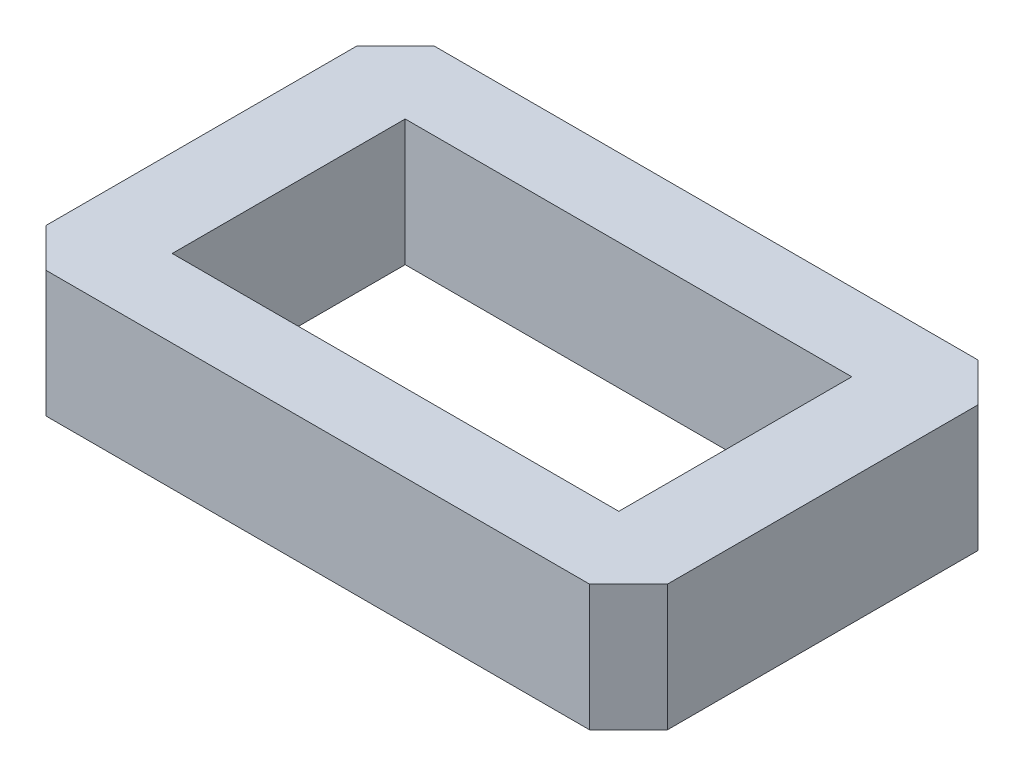
ISO-10303-21;
HEADER;
FILE_DESCRIPTION(('STEP AP214'),'2;1');
FILE_NAME('part.step','',(''),(''),'','','');
FILE_SCHEMA(('AUTOMOTIVE_DESIGN { 1 0 10303 214 1 1 1 1 }'));
ENDSEC;
DATA;
#1=APPLICATION_CONTEXT('core data for automotive mechanical design processes');
#2=APPLICATION_PROTOCOL_DEFINITION('international standard','automotive_design',2000,#1);
#3=PRODUCT_CONTEXT('',#1,'mechanical');
#4=PRODUCT('Part','Part','',(#3));
#5=PRODUCT_RELATED_PRODUCT_CATEGORY('part','',(#4));
#6=PRODUCT_DEFINITION_FORMATION('','',#4);
#7=PRODUCT_DEFINITION_CONTEXT('part definition',#1,'design');
#8=PRODUCT_DEFINITION('design','',#6,#7);
#9=PRODUCT_DEFINITION_SHAPE('','',#8);
#10=(LENGTH_UNIT() NAMED_UNIT(*) SI_UNIT(.MILLI.,.METRE.));
#11=(NAMED_UNIT(*) PLANE_ANGLE_UNIT() SI_UNIT($,.RADIAN.));
#12=(NAMED_UNIT(*) SI_UNIT($,.STERADIAN.) SOLID_ANGLE_UNIT());
#13=UNCERTAINTY_MEASURE_WITH_UNIT(LENGTH_MEASURE(1.E-05),#10,'distance_accuracy_value','');
#14=(GEOMETRIC_REPRESENTATION_CONTEXT(3) GLOBAL_UNCERTAINTY_ASSIGNED_CONTEXT((#13)) GLOBAL_UNIT_ASSIGNED_CONTEXT((#10,
#11,#12)) REPRESENTATION_CONTEXT('',''));
#15=CARTESIAN_POINT('',(0.,0.,0.));
#16=DIRECTION('',(0.,0.,1.));
#17=DIRECTION('',(1.,0.,0.));
#18=AXIS2_PLACEMENT_3D('',#15,#16,#17);
#19=CARTESIAN_POINT('',(0.,6.5,0.));
#20=DIRECTION('',(0.,-1.,0.));
#21=DIRECTION('',(0.,0.,-1.));
#22=AXIS2_PLACEMENT_3D('',#19,#20,#21);
#23=PLANE('',#22);
#24=DIRECTION('',(0.,0.,-1.));
#25=VECTOR('',#24,1.);
#26=CARTESIAN_POINT('',(32.,6.5,0.));
#27=LINE('',#26,#25);
#28=CARTESIAN_POINT('',(32.,6.5,-2.));
#29=VERTEX_POINT('',#28);
#30=CARTESIAN_POINT('',(32.,6.5,-18.));
#31=VERTEX_POINT('',#30);
#32=EDGE_CURVE('E178',#29,#31,#27,.T.);
#33=ORIENTED_EDGE('',*,*,#32,.T.);
#34=DIRECTION('',(0.707106781186546,0.,0.707106781186549));
#35=VECTOR('',#34,1.);
#36=CARTESIAN_POINT('',(30.,6.5,-20.));
#37=LINE('',#36,#35);
#38=CARTESIAN_POINT('',(30.,6.5,-20.));
#39=VERTEX_POINT('',#38);
#40=EDGE_CURVE('E216',#31,#39,#37,.F.);
#41=ORIENTED_EDGE('',*,*,#40,.T.);
#42=DIRECTION('',(-1.,0.,0.));
#43=VECTOR('',#42,1.);
#44=CARTESIAN_POINT('',(0.,6.5,-20.));
#45=LINE('',#44,#43);
#46=CARTESIAN_POINT('',(2.,6.5,-20.));
#47=VERTEX_POINT('',#46);
#48=EDGE_CURVE('E181',#39,#47,#45,.T.);
#49=ORIENTED_EDGE('',*,*,#48,.T.);
#50=DIRECTION('',(0.707106781186548,0.,-0.707106781186547));
#51=VECTOR('',#50,1.);
#52=CARTESIAN_POINT('',(0.,6.5,-18.));
#53=LINE('',#52,#51);
#54=CARTESIAN_POINT('',(0.,6.5,-18.));
#55=VERTEX_POINT('',#54);
#56=EDGE_CURVE('E214',#47,#55,#53,.F.);
#57=ORIENTED_EDGE('',*,*,#56,.T.);
#58=DIRECTION('',(0.,0.,1.));
#59=VECTOR('',#58,1.);
#60=CARTESIAN_POINT('',(0.,6.5,0.));
#61=LINE('',#60,#59);
#62=CARTESIAN_POINT('',(0.,6.5,-2.));
#63=VERTEX_POINT('',#62);
#64=EDGE_CURVE('E173',#55,#63,#61,.T.);
#65=ORIENTED_EDGE('',*,*,#64,.T.);
#66=DIRECTION('',(-0.707106781186546,0.,-0.707106781186549));
#67=VECTOR('',#66,1.);
#68=CARTESIAN_POINT('',(2.,6.5,0.));
#69=LINE('',#68,#67);
#70=CARTESIAN_POINT('',(2.,6.5,0.));
#71=VERTEX_POINT('',#70);
#72=EDGE_CURVE('E61',#63,#71,#69,.F.);
#73=ORIENTED_EDGE('',*,*,#72,.T.);
#74=DIRECTION('',(1.,0.,0.));
#75=VECTOR('',#74,1.);
#76=CARTESIAN_POINT('',(0.,6.5,0.));
#77=LINE('',#76,#75);
#78=CARTESIAN_POINT('',(30.,6.5,0.));
#79=VERTEX_POINT('',#78);
#80=EDGE_CURVE('E175',#71,#79,#77,.T.);
#81=ORIENTED_EDGE('',*,*,#80,.T.);
#82=DIRECTION('',(-0.707106781186549,0.,0.707106781186546));
#83=VECTOR('',#82,1.);
#84=CARTESIAN_POINT('',(32.,6.5,-2.));
#85=LINE('',#84,#83);
#86=EDGE_CURVE('E211',#79,#29,#85,.F.);
#87=ORIENTED_EDGE('',*,*,#86,.T.);
#88=EDGE_LOOP('',(#33,#41,#49,#57,#65,#73,#81,#87));
#89=FACE_BOUND('',#88,.T.);
#90=DIRECTION('',(1.,0.,0.));
#91=VECTOR('',#90,1.);
#92=CARTESIAN_POINT('',(0.,6.5,-16.));
#93=LINE('',#92,#91);
#94=CARTESIAN_POINT('',(4.5,6.5,-16.));
#95=VERTEX_POINT('',#94);
#96=CARTESIAN_POINT('',(27.5,6.5,-16.));
#97=VERTEX_POINT('',#96);
#98=EDGE_CURVE('E148',#95,#97,#93,.T.);
#99=ORIENTED_EDGE('',*,*,#98,.T.);
#100=DIRECTION('',(0.,0.,-1.));
#101=VECTOR('',#100,1.);
#102=CARTESIAN_POINT('',(27.5,6.5,0.));
#103=LINE('',#102,#101);
#104=CARTESIAN_POINT('',(27.5,6.5,-4.00000000000001));
#105=VERTEX_POINT('',#104);
#106=EDGE_CURVE('E154',#105,#97,#103,.T.);
#107=ORIENTED_EDGE('',*,*,#106,.F.);
#108=DIRECTION('',(1.,0.,0.));
#109=VECTOR('',#108,1.);
#110=CARTESIAN_POINT('',(0.,6.5,-4.00000000000001));
#111=LINE('',#110,#109);
#112=CARTESIAN_POINT('',(4.5,6.5,-4.00000000000001));
#113=VERTEX_POINT('',#112);
#114=EDGE_CURVE('E157',#113,#105,#111,.T.);
#115=ORIENTED_EDGE('',*,*,#114,.F.);
#116=DIRECTION('',(0.,0.,-1.));
#117=VECTOR('',#116,1.);
#118=CARTESIAN_POINT('',(4.5,6.5,0.));
#119=LINE('',#118,#117);
#120=EDGE_CURVE('E163',#113,#95,#119,.T.);
#121=ORIENTED_EDGE('',*,*,#120,.T.);
#122=EDGE_LOOP('',(#99,#107,#115,#121));
#123=FACE_BOUND('',#122,.T.);
#124=ADVANCED_FACE('F39',(#89,#123),#23,.F.);
#125=CARTESIAN_POINT('',(0.,0.,0.));
#126=DIRECTION('',(0.,-1.,0.));
#127=DIRECTION('',(0.,0.,-1.));
#128=AXIS2_PLACEMENT_3D('',#125,#126,#127);
#129=PLANE('',#128);
#130=DIRECTION('',(-1.,0.,0.));
#131=VECTOR('',#130,1.);
#132=CARTESIAN_POINT('',(0.,0.,-20.));
#133=LINE('',#132,#131);
#134=CARTESIAN_POINT('',(30.,0.,-20.));
#135=VERTEX_POINT('',#134);
#136=CARTESIAN_POINT('',(2.,0.,-20.));
#137=VERTEX_POINT('',#136);
#138=EDGE_CURVE('E176',#135,#137,#133,.T.);
#139=ORIENTED_EDGE('',*,*,#138,.F.);
#140=DIRECTION('',(-0.707106781186546,0.,-0.707106781186549));
#141=VECTOR('',#140,1.);
#142=CARTESIAN_POINT('',(25.0000000000001,0.,-25.));
#143=LINE('',#142,#141);
#144=CARTESIAN_POINT('',(32.,0.,-18.));
#145=VERTEX_POINT('',#144);
#146=EDGE_CURVE('E204',#135,#145,#143,.F.);
#147=ORIENTED_EDGE('',*,*,#146,.T.);
#148=DIRECTION('',(0.,0.,-1.));
#149=VECTOR('',#148,1.);
#150=CARTESIAN_POINT('',(32.,0.,0.));
#151=LINE('',#150,#149);
#152=CARTESIAN_POINT('',(32.,0.,-2.));
#153=VERTEX_POINT('',#152);
#154=EDGE_CURVE('E189',#153,#145,#151,.T.);
#155=ORIENTED_EDGE('',*,*,#154,.F.);
#156=DIRECTION('',(0.707106781186549,0.,-0.707106781186546));
#157=VECTOR('',#156,1.);
#158=CARTESIAN_POINT('',(14.9999999999999,0.,15.));
#159=LINE('',#158,#157);
#160=CARTESIAN_POINT('',(30.,0.,0.));
#161=VERTEX_POINT('',#160);
#162=EDGE_CURVE('E198',#153,#161,#159,.F.);
#163=ORIENTED_EDGE('',*,*,#162,.T.);
#164=DIRECTION('',(1.,0.,0.));
#165=VECTOR('',#164,1.);
#166=CARTESIAN_POINT('',(0.,0.,0.));
#167=LINE('',#166,#165);
#168=CARTESIAN_POINT('',(2.,0.,0.));
#169=VERTEX_POINT('',#168);
#170=EDGE_CURVE('E187',#169,#161,#167,.T.);
#171=ORIENTED_EDGE('',*,*,#170,.F.);
#172=DIRECTION('',(0.707106781186546,0.,0.707106781186549));
#173=VECTOR('',#172,1.);
#174=CARTESIAN_POINT('',(1.,0.,-0.999999999999998));
#175=LINE('',#174,#173);
#176=CARTESIAN_POINT('',(0.,0.,-2.));
#177=VERTEX_POINT('',#176);
#178=EDGE_CURVE('E200',#169,#177,#175,.F.);
#179=ORIENTED_EDGE('',*,*,#178,.T.);
#180=DIRECTION('',(0.,0.,1.));
#181=VECTOR('',#180,1.);
#182=CARTESIAN_POINT('',(0.,0.,0.));
#183=LINE('',#182,#181);
#184=CARTESIAN_POINT('',(0.,0.,-18.));
#185=VERTEX_POINT('',#184);
#186=EDGE_CURVE('E169',#185,#177,#183,.T.);
#187=ORIENTED_EDGE('',*,*,#186,.F.);
#188=DIRECTION('',(-0.707106781186548,0.,0.707106781186547));
#189=VECTOR('',#188,1.);
#190=CARTESIAN_POINT('',(-9.,0.,-9.00000000000001));
#191=LINE('',#190,#189);
#192=EDGE_CURVE('E202',#185,#137,#191,.F.);
#193=ORIENTED_EDGE('',*,*,#192,.T.);
#194=EDGE_LOOP('',(#139,#147,#155,#163,#171,#179,#187,#193));
#195=FACE_BOUND('',#194,.T.);
#196=DIRECTION('',(0.,0.,-1.));
#197=VECTOR('',#196,1.);
#198=CARTESIAN_POINT('',(27.5,0.,0.));
#199=LINE('',#198,#197);
#200=CARTESIAN_POINT('',(27.5,0.,-4.00000000000001));
#201=VERTEX_POINT('',#200);
#202=CARTESIAN_POINT('',(27.5,0.,-16.));
#203=VERTEX_POINT('',#202);
#204=EDGE_CURVE('E149',#201,#203,#199,.T.);
#205=ORIENTED_EDGE('',*,*,#204,.T.);
#206=DIRECTION('',(1.,0.,0.));
#207=VECTOR('',#206,1.);
#208=CARTESIAN_POINT('',(0.,0.,-16.));
#209=LINE('',#208,#207);
#210=CARTESIAN_POINT('',(4.5,0.,-16.));
#211=VERTEX_POINT('',#210);
#212=EDGE_CURVE('E142',#211,#203,#209,.T.);
#213=ORIENTED_EDGE('',*,*,#212,.F.);
#214=DIRECTION('',(0.,0.,-1.));
#215=VECTOR('',#214,1.);
#216=CARTESIAN_POINT('',(4.5,0.,0.));
#217=LINE('',#216,#215);
#218=CARTESIAN_POINT('',(4.5,0.,-4.00000000000001));
#219=VERTEX_POINT('',#218);
#220=EDGE_CURVE('E131',#219,#211,#217,.T.);
#221=ORIENTED_EDGE('',*,*,#220,.F.);
#222=DIRECTION('',(1.,0.,0.));
#223=VECTOR('',#222,1.);
#224=CARTESIAN_POINT('',(0.,0.,-4.00000000000001));
#225=LINE('',#224,#223);
#226=EDGE_CURVE('E141',#219,#201,#225,.T.);
#227=ORIENTED_EDGE('',*,*,#226,.T.);
#228=EDGE_LOOP('',(#205,#213,#221,#227));
#229=FACE_BOUND('',#228,.T.);
#230=ADVANCED_FACE('F152',(#195,#229),#129,.T.);
#231=CARTESIAN_POINT('',(0.,6.5,0.));
#232=DIRECTION('',(1.,0.,0.));
#233=DIRECTION('',(0.,0.,-1.));
#234=AXIS2_PLACEMENT_3D('',#231,#232,#233);
#235=PLANE('',#234);
#236=ORIENTED_EDGE('',*,*,#64,.F.);
#237=DIRECTION('',(0.,-1.,0.));
#238=VECTOR('',#237,1.);
#239=CARTESIAN_POINT('',(0.,6.5,-18.));
#240=LINE('',#239,#238);
#241=EDGE_CURVE('E220',#55,#185,#240,.T.);
#242=ORIENTED_EDGE('',*,*,#241,.T.);
#243=ORIENTED_EDGE('',*,*,#186,.T.);
#244=DIRECTION('',(0.,1.,0.));
#245=VECTOR('',#244,1.);
#246=CARTESIAN_POINT('',(0.,6.5,-2.));
#247=LINE('',#246,#245);
#248=EDGE_CURVE('E218',#177,#63,#247,.T.);
#249=ORIENTED_EDGE('',*,*,#248,.T.);
#250=EDGE_LOOP('',(#236,#242,#243,#249));
#251=FACE_BOUND('',#250,.T.);
#252=ADVANCED_FACE('F226',(#251),#235,.F.);
#253=CARTESIAN_POINT('',(0.,6.5,0.));
#254=DIRECTION('',(0.,0.,-1.));
#255=DIRECTION('',(-1.,0.,0.));
#256=AXIS2_PLACEMENT_3D('',#253,#254,#255);
#257=PLANE('',#256);
#258=ORIENTED_EDGE('',*,*,#80,.F.);
#259=DIRECTION('',(0.,-1.,0.));
#260=VECTOR('',#259,1.);
#261=CARTESIAN_POINT('',(2.,6.5,0.));
#262=LINE('',#261,#260);
#263=EDGE_CURVE('E11',#71,#169,#262,.T.);
#264=ORIENTED_EDGE('',*,*,#263,.T.);
#265=ORIENTED_EDGE('',*,*,#170,.T.);
#266=DIRECTION('',(0.,1.,0.));
#267=VECTOR('',#266,1.);
#268=CARTESIAN_POINT('',(30.,6.5,0.));
#269=LINE('',#268,#267);
#270=EDGE_CURVE('E48',#161,#79,#269,.T.);
#271=ORIENTED_EDGE('',*,*,#270,.T.);
#272=EDGE_LOOP('',(#258,#264,#265,#271));
#273=FACE_BOUND('',#272,.T.);
#274=ADVANCED_FACE('F236',(#273),#257,.F.);
#275=CARTESIAN_POINT('',(32.,6.5,0.));
#276=DIRECTION('',(-1.,0.,0.));
#277=DIRECTION('',(0.,0.,1.));
#278=AXIS2_PLACEMENT_3D('',#275,#276,#277);
#279=PLANE('',#278);
#280=ORIENTED_EDGE('',*,*,#154,.T.);
#281=DIRECTION('',(0.,1.,0.));
#282=VECTOR('',#281,1.);
#283=CARTESIAN_POINT('',(32.,6.5,-18.));
#284=LINE('',#283,#282);
#285=EDGE_CURVE('E209',#145,#31,#284,.T.);
#286=ORIENTED_EDGE('',*,*,#285,.T.);
#287=ORIENTED_EDGE('',*,*,#32,.F.);
#288=DIRECTION('',(0.,-1.,0.));
#289=VECTOR('',#288,1.);
#290=CARTESIAN_POINT('',(32.,6.5,-2.));
#291=LINE('',#290,#289);
#292=EDGE_CURVE('E206',#29,#153,#291,.T.);
#293=ORIENTED_EDGE('',*,*,#292,.T.);
#294=EDGE_LOOP('',(#280,#286,#287,#293));
#295=FACE_BOUND('',#294,.T.);
#296=ADVANCED_FACE('F244',(#295),#279,.F.);
#297=CARTESIAN_POINT('',(0.,6.5,-20.));
#298=DIRECTION('',(0.,0.,1.));
#299=DIRECTION('',(1.,0.,0.));
#300=AXIS2_PLACEMENT_3D('',#297,#298,#299);
#301=PLANE('',#300);
#302=ORIENTED_EDGE('',*,*,#48,.F.);
#303=DIRECTION('',(0.,-1.,0.));
#304=VECTOR('',#303,1.);
#305=CARTESIAN_POINT('',(30.,6.5,-20.));
#306=LINE('',#305,#304);
#307=EDGE_CURVE('E195',#39,#135,#306,.T.);
#308=ORIENTED_EDGE('',*,*,#307,.T.);
#309=ORIENTED_EDGE('',*,*,#138,.T.);
#310=DIRECTION('',(0.,1.,0.));
#311=VECTOR('',#310,1.);
#312=CARTESIAN_POINT('',(2.,6.5,-20.));
#313=LINE('',#312,#311);
#314=EDGE_CURVE('E184',#137,#47,#313,.T.);
#315=ORIENTED_EDGE('',*,*,#314,.T.);
#316=EDGE_LOOP('',(#302,#308,#309,#315));
#317=FACE_BOUND('',#316,.T.);
#318=ADVANCED_FACE('F252',(#317),#301,.F.);
#319=CARTESIAN_POINT('',(0.,0.,-16.));
#320=DIRECTION('',(0.,0.,1.));
#321=DIRECTION('',(1.,0.,0.));
#322=AXIS2_PLACEMENT_3D('',#319,#320,#321);
#323=PLANE('',#322);
#324=ORIENTED_EDGE('',*,*,#98,.F.);
#325=DIRECTION('',(0.,1.,0.));
#326=VECTOR('',#325,1.);
#327=CARTESIAN_POINT('',(4.5,0.,-16.));
#328=LINE('',#327,#326);
#329=EDGE_CURVE('E135',#211,#95,#328,.T.);
#330=ORIENTED_EDGE('',*,*,#329,.F.);
#331=ORIENTED_EDGE('',*,*,#212,.T.);
#332=DIRECTION('',(0.,1.,0.));
#333=VECTOR('',#332,1.);
#334=CARTESIAN_POINT('',(27.5,0.,-16.));
#335=LINE('',#334,#333);
#336=EDGE_CURVE('E167',#203,#97,#335,.T.);
#337=ORIENTED_EDGE('',*,*,#336,.T.);
#338=EDGE_LOOP('',(#324,#330,#331,#337));
#339=FACE_BOUND('',#338,.T.);
#340=ADVANCED_FACE('F145',(#339),#323,.T.);
#341=CARTESIAN_POINT('',(27.5,0.,0.));
#342=DIRECTION('',(1.,0.,0.));
#343=DIRECTION('',(0.,0.,-1.));
#344=AXIS2_PLACEMENT_3D('',#341,#342,#343);
#345=PLANE('',#344);
#346=ORIENTED_EDGE('',*,*,#106,.T.);
#347=ORIENTED_EDGE('',*,*,#336,.F.);
#348=ORIENTED_EDGE('',*,*,#204,.F.);
#349=DIRECTION('',(0.,1.,0.));
#350=VECTOR('',#349,1.);
#351=CARTESIAN_POINT('',(27.5,0.,-4.00000000000001));
#352=LINE('',#351,#350);
#353=EDGE_CURVE('E170',#201,#105,#352,.T.);
#354=ORIENTED_EDGE('',*,*,#353,.T.);
#355=EDGE_LOOP('',(#346,#347,#348,#354));
#356=FACE_BOUND('',#355,.T.);
#357=ADVANCED_FACE('F312',(#356),#345,.F.);
#358=CARTESIAN_POINT('',(0.,0.,-4.00000000000001));
#359=DIRECTION('',(0.,0.,1.));
#360=DIRECTION('',(1.,0.,0.));
#361=AXIS2_PLACEMENT_3D('',#358,#359,#360);
#362=PLANE('',#361);
#363=ORIENTED_EDGE('',*,*,#114,.T.);
#364=ORIENTED_EDGE('',*,*,#353,.F.);
#365=ORIENTED_EDGE('',*,*,#226,.F.);
#366=DIRECTION('',(0.,1.,0.));
#367=VECTOR('',#366,1.);
#368=CARTESIAN_POINT('',(4.5,0.,-4.00000000000001));
#369=LINE('',#368,#367);
#370=EDGE_CURVE('E137',#219,#113,#369,.T.);
#371=ORIENTED_EDGE('',*,*,#370,.T.);
#372=EDGE_LOOP('',(#363,#364,#365,#371));
#373=FACE_BOUND('',#372,.T.);
#374=ADVANCED_FACE('F318',(#373),#362,.F.);
#375=CARTESIAN_POINT('',(4.5,0.,0.));
#376=DIRECTION('',(1.,0.,0.));
#377=DIRECTION('',(0.,0.,-1.));
#378=AXIS2_PLACEMENT_3D('',#375,#376,#377);
#379=PLANE('',#378);
#380=ORIENTED_EDGE('',*,*,#120,.F.);
#381=ORIENTED_EDGE('',*,*,#370,.F.);
#382=ORIENTED_EDGE('',*,*,#220,.T.);
#383=ORIENTED_EDGE('',*,*,#329,.T.);
#384=EDGE_LOOP('',(#380,#381,#382,#383));
#385=FACE_BOUND('',#384,.T.);
#386=ADVANCED_FACE('F134',(#385),#379,.T.);
#387=CARTESIAN_POINT('',(30.,6.5,-20.));
#388=DIRECTION('',(-0.707106781186549,0.,0.707106781186546));
#389=DIRECTION('',(0.,-1.,0.));
#390=AXIS2_PLACEMENT_3D('',#387,#388,#389);
#391=PLANE('',#390);
#392=ORIENTED_EDGE('',*,*,#40,.F.);
#393=ORIENTED_EDGE('',*,*,#285,.F.);
#394=ORIENTED_EDGE('',*,*,#146,.F.);
#395=ORIENTED_EDGE('',*,*,#307,.F.);
#396=EDGE_LOOP('',(#392,#393,#394,#395));
#397=FACE_BOUND('',#396,.T.);
#398=ADVANCED_FACE('F249',(#397),#391,.F.);
#399=CARTESIAN_POINT('',(0.,6.5,-18.));
#400=DIRECTION('',(0.707106781186547,0.,0.707106781186548));
#401=DIRECTION('',(0.,-1.,0.));
#402=AXIS2_PLACEMENT_3D('',#399,#400,#401);
#403=PLANE('',#402);
#404=ORIENTED_EDGE('',*,*,#56,.F.);
#405=ORIENTED_EDGE('',*,*,#314,.F.);
#406=ORIENTED_EDGE('',*,*,#192,.F.);
#407=ORIENTED_EDGE('',*,*,#241,.F.);
#408=EDGE_LOOP('',(#404,#405,#406,#407));
#409=FACE_BOUND('',#408,.T.);
#410=ADVANCED_FACE('F254',(#409),#403,.F.);
#411=CARTESIAN_POINT('',(2.,6.5,0.));
#412=DIRECTION('',(0.707106781186549,0.,-0.707106781186546));
#413=DIRECTION('',(0.,-1.,0.));
#414=AXIS2_PLACEMENT_3D('',#411,#412,#413);
#415=PLANE('',#414);
#416=ORIENTED_EDGE('',*,*,#72,.F.);
#417=ORIENTED_EDGE('',*,*,#248,.F.);
#418=ORIENTED_EDGE('',*,*,#178,.F.);
#419=ORIENTED_EDGE('',*,*,#263,.F.);
#420=EDGE_LOOP('',(#416,#417,#418,#419));
#421=FACE_BOUND('',#420,.T.);
#422=ADVANCED_FACE('F235',(#421),#415,.F.);
#423=CARTESIAN_POINT('',(32.,6.5,-2.));
#424=DIRECTION('',(-0.707106781186546,0.,-0.707106781186549));
#425=DIRECTION('',(0.,-1.,0.));
#426=AXIS2_PLACEMENT_3D('',#423,#424,#425);
#427=PLANE('',#426);
#428=ORIENTED_EDGE('',*,*,#86,.F.);
#429=ORIENTED_EDGE('',*,*,#270,.F.);
#430=ORIENTED_EDGE('',*,*,#162,.F.);
#431=ORIENTED_EDGE('',*,*,#292,.F.);
#432=EDGE_LOOP('',(#428,#429,#430,#431));
#433=FACE_BOUND('',#432,.T.);
#434=ADVANCED_FACE('F42',(#433),#427,.F.);
#435=CLOSED_SHELL('',(#124,#230,#252,#274,#296,#318,#340,#357,#374,#386,#398,#410,#422,#434));
#436=MANIFOLD_SOLID_BREP('B2',#435);
#437=ADVANCED_BREP_SHAPE_REPRESENTATION('',(#18,#436),#14);
#438=SHAPE_DEFINITION_REPRESENTATION(#9,#437);
ENDSEC;
END-ISO-10303-21;
